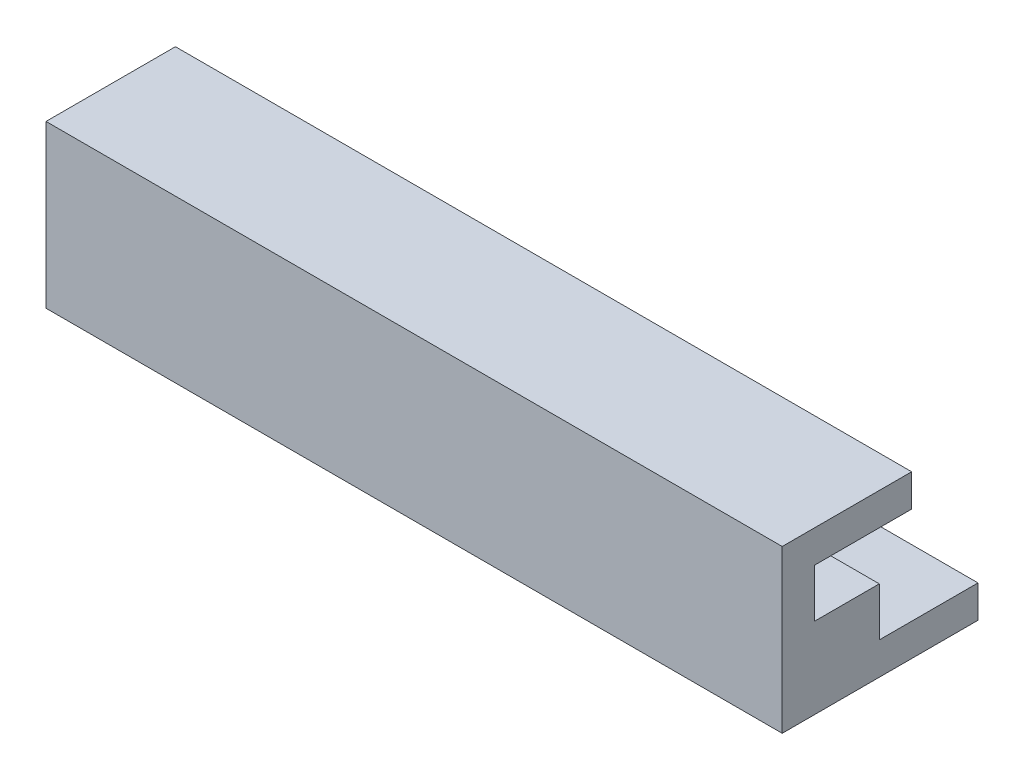
ISO-10303-21;
HEADER;
FILE_DESCRIPTION(('STEP AP214'),'2;1');
FILE_NAME('part.step','',(''),(''),'','','');
FILE_SCHEMA(('AUTOMOTIVE_DESIGN { 1 0 10303 214 1 1 1 1 }'));
ENDSEC;
DATA;
#1=APPLICATION_CONTEXT('core data for automotive mechanical design processes');
#2=APPLICATION_PROTOCOL_DEFINITION('international standard','automotive_design',2000,#1);
#3=PRODUCT_CONTEXT('',#1,'mechanical');
#4=PRODUCT('Part','Part','',(#3));
#5=PRODUCT_RELATED_PRODUCT_CATEGORY('part','',(#4));
#6=PRODUCT_DEFINITION_FORMATION('','',#4);
#7=PRODUCT_DEFINITION_CONTEXT('part definition',#1,'design');
#8=PRODUCT_DEFINITION('design','',#6,#7);
#9=PRODUCT_DEFINITION_SHAPE('','',#8);
#10=(LENGTH_UNIT() NAMED_UNIT(*) SI_UNIT(.MILLI.,.METRE.));
#11=(NAMED_UNIT(*) PLANE_ANGLE_UNIT() SI_UNIT($,.RADIAN.));
#12=(NAMED_UNIT(*) SI_UNIT($,.STERADIAN.) SOLID_ANGLE_UNIT());
#13=UNCERTAINTY_MEASURE_WITH_UNIT(LENGTH_MEASURE(1.E-05),#10,'distance_accuracy_value','');
#14=(GEOMETRIC_REPRESENTATION_CONTEXT(3) GLOBAL_UNCERTAINTY_ASSIGNED_CONTEXT((#13)) GLOBAL_UNIT_ASSIGNED_CONTEXT((#10,
#11,#12)) REPRESENTATION_CONTEXT('',''));
#15=CARTESIAN_POINT('',(0.,0.,0.));
#16=DIRECTION('',(0.,0.,1.));
#17=DIRECTION('',(1.,0.,0.));
#18=AXIS2_PLACEMENT_3D('',#15,#16,#17);
#19=CARTESIAN_POINT('',(-48.9395510953457,26.5034566253615,2.));
#20=DIRECTION('',(0.,-1.,0.));
#21=DIRECTION('',(0.,0.,-1.));
#22=AXIS2_PLACEMENT_3D('',#19,#20,#21);
#23=PLANE('',#22);
#24=DIRECTION('',(1.,0.,0.));
#25=VECTOR('',#24,1.);
#26=CARTESIAN_POINT('',(-48.9395510953457,26.5034566253615,24.));
#27=LINE('',#26,#25);
#28=CARTESIAN_POINT('',(-49.9395510953457,26.5034566253615,24.));
#29=VERTEX_POINT('',#28);
#30=CARTESIAN_POINT('',(-4.43955109534567,26.5034566253615,24.));
#31=VERTEX_POINT('',#30);
#32=EDGE_CURVE('E109',#29,#31,#27,.T.);
#33=ORIENTED_EDGE('',*,*,#32,.F.);
#34=DIRECTION('',(0.,0.,-1.));
#35=VECTOR('',#34,1.);
#36=CARTESIAN_POINT('',(-49.9395510953457,26.5034566253615,2.));
#37=LINE('',#36,#35);
#38=CARTESIAN_POINT('',(-49.9395510953457,26.5034566253615,30.1));
#39=VERTEX_POINT('',#38);
#40=EDGE_CURVE('E130',#39,#29,#37,.T.);
#41=ORIENTED_EDGE('',*,*,#40,.F.);
#42=DIRECTION('',(1.,0.,0.));
#43=VECTOR('',#42,1.);
#44=CARTESIAN_POINT('',(-49.9395510953457,26.5034566253615,30.1));
#45=LINE('',#44,#43);
#46=CARTESIAN_POINT('',(-4.43955109534568,26.5034566253615,30.1));
#47=VERTEX_POINT('',#46);
#48=EDGE_CURVE('E129',#39,#47,#45,.T.);
#49=ORIENTED_EDGE('',*,*,#48,.T.);
#50=DIRECTION('',(0.,0.,-1.));
#51=VECTOR('',#50,1.);
#52=CARTESIAN_POINT('',(-4.43955109534567,26.5034566253615,2.));
#53=LINE('',#52,#51);
#54=EDGE_CURVE('E125',#47,#31,#53,.T.);
#55=ORIENTED_EDGE('',*,*,#54,.T.);
#56=EDGE_LOOP('',(#33,#41,#49,#55));
#57=FACE_BOUND('',#56,.T.);
#58=ADVANCED_FACE('F32',(#57),#23,.F.);
#59=CARTESIAN_POINT('',(-49.9395510953457,5.50345662536146,2.));
#60=DIRECTION('',(1.,0.,0.));
#61=DIRECTION('',(0.,0.,-1.));
#62=AXIS2_PLACEMENT_3D('',#59,#60,#61);
#63=PLANE('',#62);
#64=DIRECTION('',(0.,1.,0.));
#65=VECTOR('',#64,1.);
#66=CARTESIAN_POINT('',(-49.9395510953457,5.50345662536146,24.));
#67=LINE('',#66,#65);
#68=CARTESIAN_POINT('',(-49.9395510953457,24.5034566253615,24.));
#69=VERTEX_POINT('',#68);
#70=EDGE_CURVE('E115',#69,#29,#67,.T.);
#71=ORIENTED_EDGE('',*,*,#70,.F.);
#72=DIRECTION('',(0.,0.,1.));
#73=VECTOR('',#72,1.);
#74=CARTESIAN_POINT('',(-49.9395510953457,24.5034566253615,20.6071928872946));
#75=LINE('',#74,#73);
#76=CARTESIAN_POINT('',(-49.9395510953457,24.5034566253615,36.1));
#77=VERTEX_POINT('',#76);
#78=EDGE_CURVE('E170',#69,#77,#75,.T.);
#79=ORIENTED_EDGE('',*,*,#78,.T.);
#80=DIRECTION('',(0.,1.,0.));
#81=VECTOR('',#80,1.);
#82=CARTESIAN_POINT('',(-49.9395510953457,24.5034566253615,36.1));
#83=LINE('',#82,#81);
#84=CARTESIAN_POINT('',(-49.9395510953457,34.5034566253615,36.1));
#85=VERTEX_POINT('',#84);
#86=EDGE_CURVE('E175',#77,#85,#83,.T.);
#87=ORIENTED_EDGE('',*,*,#86,.T.);
#88=DIRECTION('',(0.,0.,1.));
#89=VECTOR('',#88,1.);
#90=CARTESIAN_POINT('',(-49.9395510953457,34.5034566253615,34.1));
#91=LINE('',#90,#89);
#92=CARTESIAN_POINT('',(-49.9395510953457,34.5034566253615,28.1));
#93=VERTEX_POINT('',#92);
#94=EDGE_CURVE('E162',#93,#85,#91,.T.);
#95=ORIENTED_EDGE('',*,*,#94,.F.);
#96=DIRECTION('',(0.,-1.,0.));
#97=VECTOR('',#96,1.);
#98=CARTESIAN_POINT('',(-49.9395510953457,32.5034566253615,28.1));
#99=LINE('',#98,#97);
#100=CARTESIAN_POINT('',(-49.9395510953457,32.5034566253615,28.1));
#101=VERTEX_POINT('',#100);
#102=EDGE_CURVE('E152',#93,#101,#99,.T.);
#103=ORIENTED_EDGE('',*,*,#102,.T.);
#104=DIRECTION('',(0.,0.,1.));
#105=VECTOR('',#104,1.);
#106=CARTESIAN_POINT('',(-49.9395510953457,32.5034566253615,28.1));
#107=LINE('',#106,#105);
#108=CARTESIAN_POINT('',(-49.9395510953457,32.5034566253615,34.1));
#109=VERTEX_POINT('',#108);
#110=EDGE_CURVE('E142',#101,#109,#107,.T.);
#111=ORIENTED_EDGE('',*,*,#110,.T.);
#112=DIRECTION('',(0.,-1.,0.));
#113=VECTOR('',#112,1.);
#114=CARTESIAN_POINT('',(-49.9395510953457,33.5034566253615,34.1));
#115=LINE('',#114,#113);
#116=CARTESIAN_POINT('',(-49.9395510953457,29.5034566253615,34.1));
#117=VERTEX_POINT('',#116);
#118=EDGE_CURVE('E150',#109,#117,#115,.T.);
#119=ORIENTED_EDGE('',*,*,#118,.T.);
#120=DIRECTION('',(0.,0.,1.));
#121=VECTOR('',#120,1.);
#122=CARTESIAN_POINT('',(-49.9395510953457,29.5034566253615,30.1));
#123=LINE('',#122,#121);
#124=CARTESIAN_POINT('',(-49.9395510953457,29.5034566253615,30.1));
#125=VERTEX_POINT('',#124);
#126=EDGE_CURVE('E195',#125,#117,#123,.T.);
#127=ORIENTED_EDGE('',*,*,#126,.F.);
#128=DIRECTION('',(0.,-1.,0.));
#129=VECTOR('',#128,1.);
#130=CARTESIAN_POINT('',(-49.9395510953457,29.5034566253615,30.1));
#131=LINE('',#130,#129);
#132=EDGE_CURVE('E202',#125,#39,#131,.T.);
#133=ORIENTED_EDGE('',*,*,#132,.T.);
#134=ORIENTED_EDGE('',*,*,#40,.T.);
#135=EDGE_LOOP('',(#71,#79,#87,#95,#103,#111,#119,#127,#133,#134));
#136=FACE_BOUND('',#135,.T.);
#137=ADVANCED_FACE('F34',(#136),#63,.F.);
#138=CARTESIAN_POINT('',(-4.43955109534567,26.5034566253615,2.));
#139=DIRECTION('',(-1.,0.,0.));
#140=DIRECTION('',(0.,0.,1.));
#141=AXIS2_PLACEMENT_3D('',#138,#139,#140);
#142=PLANE('',#141);
#143=DIRECTION('',(0.,-1.,0.));
#144=VECTOR('',#143,1.);
#145=CARTESIAN_POINT('',(-4.43955109534567,26.5034566253615,24.));
#146=LINE('',#145,#144);
#147=CARTESIAN_POINT('',(-4.43955109534567,24.5034566253615,24.));
#148=VERTEX_POINT('',#147);
#149=EDGE_CURVE('E112',#31,#148,#146,.T.);
#150=ORIENTED_EDGE('',*,*,#149,.F.);
#151=ORIENTED_EDGE('',*,*,#54,.F.);
#152=DIRECTION('',(0.,1.,0.));
#153=VECTOR('',#152,1.);
#154=CARTESIAN_POINT('',(-4.43955109534567,29.5034566253615,30.1));
#155=LINE('',#154,#153);
#156=CARTESIAN_POINT('',(-4.43955109534567,29.5034566253615,30.1));
#157=VERTEX_POINT('',#156);
#158=EDGE_CURVE('E197',#47,#157,#155,.T.);
#159=ORIENTED_EDGE('',*,*,#158,.T.);
#160=DIRECTION('',(0.,0.,1.));
#161=VECTOR('',#160,1.);
#162=CARTESIAN_POINT('',(-4.43955109534567,29.5034566253615,30.1));
#163=LINE('',#162,#161);
#164=CARTESIAN_POINT('',(-4.43955109534567,29.5034566253615,34.1));
#165=VERTEX_POINT('',#164);
#166=EDGE_CURVE('E190',#157,#165,#163,.T.);
#167=ORIENTED_EDGE('',*,*,#166,.T.);
#168=DIRECTION('',(0.,1.,0.));
#169=VECTOR('',#168,1.);
#170=CARTESIAN_POINT('',(-4.43955109534567,34.5034566253615,34.1));
#171=LINE('',#170,#169);
#172=CARTESIAN_POINT('',(-4.43955109534567,32.5034566253615,34.1));
#173=VERTEX_POINT('',#172);
#174=EDGE_CURVE('E159',#165,#173,#171,.T.);
#175=ORIENTED_EDGE('',*,*,#174,.T.);
#176=DIRECTION('',(0.,0.,1.));
#177=VECTOR('',#176,1.);
#178=CARTESIAN_POINT('',(-4.43955109534567,32.5034566253615,28.1));
#179=LINE('',#178,#177);
#180=CARTESIAN_POINT('',(-4.43955109534567,32.5034566253615,28.1));
#181=VERTEX_POINT('',#180);
#182=EDGE_CURVE('E144',#181,#173,#179,.T.);
#183=ORIENTED_EDGE('',*,*,#182,.F.);
#184=DIRECTION('',(0.,1.,0.));
#185=VECTOR('',#184,1.);
#186=CARTESIAN_POINT('',(-4.43955109534567,34.5034566253615,28.1));
#187=LINE('',#186,#185);
#188=CARTESIAN_POINT('',(-4.43955109534567,34.5034566253615,28.1));
#189=VERTEX_POINT('',#188);
#190=EDGE_CURVE('E185',#181,#189,#187,.T.);
#191=ORIENTED_EDGE('',*,*,#190,.T.);
#192=DIRECTION('',(0.,0.,1.));
#193=VECTOR('',#192,1.);
#194=CARTESIAN_POINT('',(-4.43955109534567,34.5034566253615,34.1));
#195=LINE('',#194,#193);
#196=CARTESIAN_POINT('',(-4.43955109534567,34.5034566253615,36.1));
#197=VERTEX_POINT('',#196);
#198=EDGE_CURVE('E158',#189,#197,#195,.T.);
#199=ORIENTED_EDGE('',*,*,#198,.T.);
#200=DIRECTION('',(0.,1.,0.));
#201=VECTOR('',#200,1.);
#202=CARTESIAN_POINT('',(-4.43955109534568,24.5034566253615,36.1));
#203=LINE('',#202,#201);
#204=CARTESIAN_POINT('',(-4.43955109534568,24.5034566253615,36.1));
#205=VERTEX_POINT('',#204);
#206=EDGE_CURVE('E133',#205,#197,#203,.T.);
#207=ORIENTED_EDGE('',*,*,#206,.F.);
#208=DIRECTION('',(0.,0.,-1.));
#209=VECTOR('',#208,1.);
#210=CARTESIAN_POINT('',(-4.43955109534568,24.5034566253615,20.6071928872946));
#211=LINE('',#210,#209);
#212=EDGE_CURVE('E126',#205,#148,#211,.T.);
#213=ORIENTED_EDGE('',*,*,#212,.T.);
#214=EDGE_LOOP('',(#150,#151,#159,#167,#175,#183,#191,#199,#207,#213));
#215=FACE_BOUND('',#214,.T.);
#216=ADVANCED_FACE('F123',(#215),#142,.F.);
#217=CARTESIAN_POINT('',(-47.9395510953457,24.5034566253615,24.));
#218=DIRECTION('',(0.,-1.,0.));
#219=DIRECTION('',(0.,0.,-1.));
#220=AXIS2_PLACEMENT_3D('',#217,#218,#219);
#221=PLANE('',#220);
#222=DIRECTION('',(1.,0.,0.));
#223=VECTOR('',#222,1.);
#224=CARTESIAN_POINT('',(0.,24.5034566253615,24.));
#225=LINE('',#224,#223);
#226=EDGE_CURVE('E47',#69,#148,#225,.T.);
#227=ORIENTED_EDGE('',*,*,#226,.T.);
#228=ORIENTED_EDGE('',*,*,#212,.F.);
#229=DIRECTION('',(1.,0.,0.));
#230=VECTOR('',#229,1.);
#231=CARTESIAN_POINT('',(-49.9395510953457,24.5034566253615,36.1));
#232=LINE('',#231,#230);
#233=EDGE_CURVE('E55',#77,#205,#232,.T.);
#234=ORIENTED_EDGE('',*,*,#233,.F.);
#235=ORIENTED_EDGE('',*,*,#78,.F.);
#236=EDGE_LOOP('',(#227,#228,#234,#235));
#237=FACE_BOUND('',#236,.T.);
#238=ADVANCED_FACE('F214',(#237),#221,.T.);
#239=CARTESIAN_POINT('',(-4.43955109534568,24.5034566253615,36.1));
#240=DIRECTION('',(0.,0.,1.));
#241=DIRECTION('',(1.,0.,0.));
#242=AXIS2_PLACEMENT_3D('',#239,#240,#241);
#243=PLANE('',#242);
#244=ORIENTED_EDGE('',*,*,#206,.T.);
#245=DIRECTION('',(-1.,0.,0.));
#246=VECTOR('',#245,1.);
#247=CARTESIAN_POINT('',(-49.9395510953457,34.5034566253615,36.1));
#248=LINE('',#247,#246);
#249=EDGE_CURVE('E164',#197,#85,#248,.T.);
#250=ORIENTED_EDGE('',*,*,#249,.T.);
#251=ORIENTED_EDGE('',*,*,#86,.F.);
#252=ORIENTED_EDGE('',*,*,#233,.T.);
#253=EDGE_LOOP('',(#244,#250,#251,#252));
#254=FACE_BOUND('',#253,.T.);
#255=ADVANCED_FACE('F182',(#254),#243,.T.);
#256=CARTESIAN_POINT('',(0.,0.,34.1));
#257=DIRECTION('',(0.,0.,-1.));
#258=DIRECTION('',(-1.,0.,0.));
#259=AXIS2_PLACEMENT_3D('',#256,#257,#258);
#260=PLANE('',#259);
#261=DIRECTION('',(1.,0.,0.));
#262=VECTOR('',#261,1.);
#263=CARTESIAN_POINT('',(0.,29.5034566253615,34.1));
#264=LINE('',#263,#262);
#265=EDGE_CURVE('E11',#117,#165,#264,.T.);
#266=ORIENTED_EDGE('',*,*,#265,.F.);
#267=ORIENTED_EDGE('',*,*,#118,.F.);
#268=DIRECTION('',(-1.,0.,0.));
#269=VECTOR('',#268,1.);
#270=CARTESIAN_POINT('',(0.,32.5034566253615,34.1));
#271=LINE('',#270,#269);
#272=EDGE_CURVE('E40',#173,#109,#271,.T.);
#273=ORIENTED_EDGE('',*,*,#272,.F.);
#274=ORIENTED_EDGE('',*,*,#174,.F.);
#275=EDGE_LOOP('',(#266,#267,#273,#274));
#276=FACE_BOUND('',#275,.T.);
#277=ADVANCED_FACE('F157',(#276),#260,.T.);
#278=CARTESIAN_POINT('',(-49.9395510953457,34.5034566253615,34.1));
#279=DIRECTION('',(0.,1.,0.));
#280=DIRECTION('',(0.,0.,1.));
#281=AXIS2_PLACEMENT_3D('',#278,#279,#280);
#282=PLANE('',#281);
#283=ORIENTED_EDGE('',*,*,#249,.F.);
#284=ORIENTED_EDGE('',*,*,#198,.F.);
#285=DIRECTION('',(-1.,0.,0.));
#286=VECTOR('',#285,1.);
#287=CARTESIAN_POINT('',(-4.43955109534567,34.5034566253615,28.1));
#288=LINE('',#287,#286);
#289=EDGE_CURVE('E181',#189,#93,#288,.T.);
#290=ORIENTED_EDGE('',*,*,#289,.T.);
#291=ORIENTED_EDGE('',*,*,#94,.T.);
#292=EDGE_LOOP('',(#283,#284,#290,#291));
#293=FACE_BOUND('',#292,.T.);
#294=ADVANCED_FACE('F179',(#293),#282,.T.);
#295=CARTESIAN_POINT('',(-4.43955109534567,32.5034566253615,28.1));
#296=DIRECTION('',(0.,-1.,0.));
#297=DIRECTION('',(0.,0.,-1.));
#298=AXIS2_PLACEMENT_3D('',#295,#296,#297);
#299=PLANE('',#298);
#300=ORIENTED_EDGE('',*,*,#182,.T.);
#301=ORIENTED_EDGE('',*,*,#272,.T.);
#302=ORIENTED_EDGE('',*,*,#110,.F.);
#303=DIRECTION('',(1.,0.,0.));
#304=VECTOR('',#303,1.);
#305=CARTESIAN_POINT('',(-4.43955109534567,32.5034566253615,28.1));
#306=LINE('',#305,#304);
#307=EDGE_CURVE('E154',#101,#181,#306,.T.);
#308=ORIENTED_EDGE('',*,*,#307,.T.);
#309=EDGE_LOOP('',(#300,#301,#302,#308));
#310=FACE_BOUND('',#309,.T.);
#311=ADVANCED_FACE('F140',(#310),#299,.T.);
#312=CARTESIAN_POINT('',(0.,0.,28.1));
#313=DIRECTION('',(0.,0.,-1.));
#314=DIRECTION('',(-1.,0.,0.));
#315=AXIS2_PLACEMENT_3D('',#312,#313,#314);
#316=PLANE('',#315);
#317=ORIENTED_EDGE('',*,*,#190,.F.);
#318=ORIENTED_EDGE('',*,*,#307,.F.);
#319=ORIENTED_EDGE('',*,*,#102,.F.);
#320=ORIENTED_EDGE('',*,*,#289,.F.);
#321=EDGE_LOOP('',(#317,#318,#319,#320));
#322=FACE_BOUND('',#321,.T.);
#323=ADVANCED_FACE('F187',(#322),#316,.T.);
#324=CARTESIAN_POINT('',(-49.715027182508,29.5034566253615,30.1));
#325=DIRECTION('',(0.,1.,0.));
#326=DIRECTION('',(0.,0.,1.));
#327=AXIS2_PLACEMENT_3D('',#324,#325,#326);
#328=PLANE('',#327);
#329=ORIENTED_EDGE('',*,*,#126,.T.);
#330=ORIENTED_EDGE('',*,*,#265,.T.);
#331=ORIENTED_EDGE('',*,*,#166,.F.);
#332=DIRECTION('',(-1.,0.,0.));
#333=VECTOR('',#332,1.);
#334=CARTESIAN_POINT('',(-49.715027182508,29.5034566253615,30.1));
#335=LINE('',#334,#333);
#336=EDGE_CURVE('E205',#157,#125,#335,.T.);
#337=ORIENTED_EDGE('',*,*,#336,.T.);
#338=EDGE_LOOP('',(#329,#330,#331,#337));
#339=FACE_BOUND('',#338,.T.);
#340=ADVANCED_FACE('F210',(#339),#328,.T.);
#341=CARTESIAN_POINT('',(0.,0.,30.1));
#342=DIRECTION('',(0.,0.,1.));
#343=DIRECTION('',(1.,0.,0.));
#344=AXIS2_PLACEMENT_3D('',#341,#342,#343);
#345=PLANE('',#344);
#346=ORIENTED_EDGE('',*,*,#336,.F.);
#347=ORIENTED_EDGE('',*,*,#158,.F.);
#348=ORIENTED_EDGE('',*,*,#48,.F.);
#349=ORIENTED_EDGE('',*,*,#132,.F.);
#350=EDGE_LOOP('',(#346,#347,#348,#349));
#351=FACE_BOUND('',#350,.T.);
#352=ADVANCED_FACE('F213',(#351),#345,.F.);
#353=CARTESIAN_POINT('',(0.,0.,24.));
#354=DIRECTION('',(0.,0.,-1.));
#355=DIRECTION('',(-1.,0.,0.));
#356=AXIS2_PLACEMENT_3D('',#353,#354,#355);
#357=PLANE('',#356);
#358=ORIENTED_EDGE('',*,*,#70,.T.);
#359=ORIENTED_EDGE('',*,*,#32,.T.);
#360=ORIENTED_EDGE('',*,*,#149,.T.);
#361=ORIENTED_EDGE('',*,*,#226,.F.);
#362=EDGE_LOOP('',(#358,#359,#360,#361));
#363=FACE_BOUND('',#362,.T.);
#364=ADVANCED_FACE('F111',(#363),#357,.T.);
#365=CLOSED_SHELL('',(#58,#137,#216,#238,#255,#277,#294,#311,#323,#340,#352,#364));
#366=MANIFOLD_SOLID_BREP('B2',#365);
#367=ADVANCED_BREP_SHAPE_REPRESENTATION('',(#18,#366),#14);
#368=SHAPE_DEFINITION_REPRESENTATION(#9,#367);
ENDSEC;
END-ISO-10303-21;
